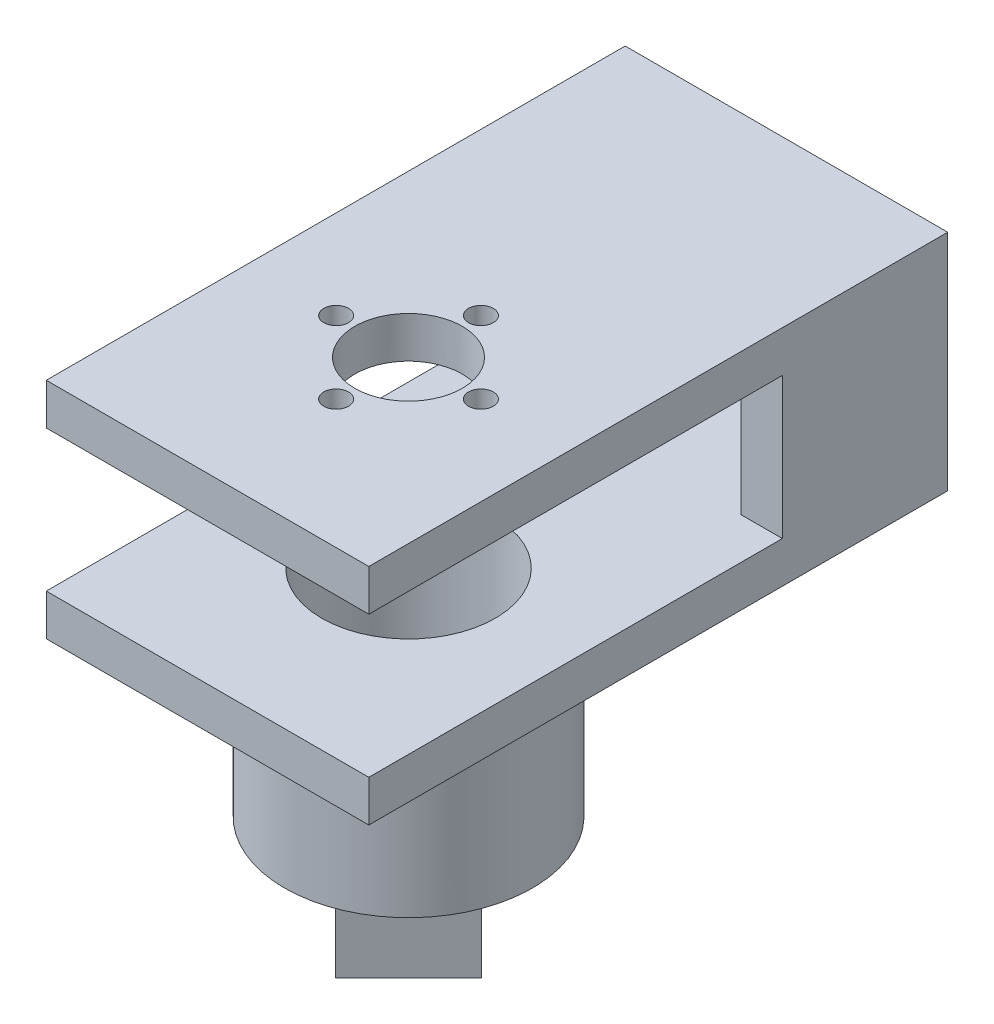
ISO-10303-21;
HEADER;
FILE_DESCRIPTION(('STEP AP214'),'2;1');
FILE_NAME('part.step','',(''),(''),'','','');
FILE_SCHEMA(('AUTOMOTIVE_DESIGN { 1 0 10303 214 1 1 1 1 }'));
ENDSEC;
DATA;
#1=APPLICATION_CONTEXT('core data for automotive mechanical design processes');
#2=APPLICATION_PROTOCOL_DEFINITION('international standard','automotive_design',2000,#1);
#3=PRODUCT_CONTEXT('',#1,'mechanical');
#4=PRODUCT('Part','Part','',(#3));
#5=PRODUCT_RELATED_PRODUCT_CATEGORY('part','',(#4));
#6=PRODUCT_DEFINITION_FORMATION('','',#4);
#7=PRODUCT_DEFINITION_CONTEXT('part definition',#1,'design');
#8=PRODUCT_DEFINITION('design','',#6,#7);
#9=PRODUCT_DEFINITION_SHAPE('','',#8);
#10=(LENGTH_UNIT() NAMED_UNIT(*) SI_UNIT(.MILLI.,.METRE.));
#11=(NAMED_UNIT(*) PLANE_ANGLE_UNIT() SI_UNIT($,.RADIAN.));
#12=(NAMED_UNIT(*) SI_UNIT($,.STERADIAN.) SOLID_ANGLE_UNIT());
#13=UNCERTAINTY_MEASURE_WITH_UNIT(LENGTH_MEASURE(1.E-05),#10,'distance_accuracy_value','');
#14=(GEOMETRIC_REPRESENTATION_CONTEXT(3) GLOBAL_UNCERTAINTY_ASSIGNED_CONTEXT((#13)) GLOBAL_UNIT_ASSIGNED_CONTEXT((#10,
#11,#12)) REPRESENTATION_CONTEXT('',''));
#15=CARTESIAN_POINT('',(0.,0.,0.));
#16=DIRECTION('',(0.,0.,1.));
#17=DIRECTION('',(1.,0.,0.));
#18=AXIS2_PLACEMENT_3D('',#15,#16,#17);
#19=CARTESIAN_POINT('',(29.,-86.1555555555556,91.3984830430161));
#20=DIRECTION('',(0.,-1.,0.));
#21=DIRECTION('',(0.,0.,-1.));
#22=AXIS2_PLACEMENT_3D('',#19,#20,#21);
#23=PLANE('',#22);
#24=CARTESIAN_POINT('',(29.,-86.1555555555556,91.3984830430161));
#25=DIRECTION('',(0.,-1.,0.));
#26=DIRECTION('',(0.,0.,-1.));
#27=AXIS2_PLACEMENT_3D('',#24,#25,#26);
#28=CIRCLE('',#27,30.);
#29=CARTESIAN_POINT('',(29.,-86.1555555555556,61.3984830430161));
#30=VERTEX_POINT('',#29);
#31=EDGE_CURVE('E245',#30,#30,#28,.T.);
#32=ORIENTED_EDGE('',*,*,#31,.T.);
#33=EDGE_LOOP('',(#32));
#34=FACE_BOUND('',#33,.T.);
#35=DIRECTION('',(-0.707106781186546,0.,-0.707106781186549));
#36=VECTOR('',#35,1.);
#37=CARTESIAN_POINT('',(11.3223304703363,-86.1555555555556,91.398483043016));
#38=LINE('',#37,#36);
#39=CARTESIAN_POINT('',(29.,-86.1555555555556,109.07615257268));
#40=VERTEX_POINT('',#39);
#41=CARTESIAN_POINT('',(11.3223304703363,-86.1555555555556,91.398483043016));
#42=VERTEX_POINT('',#41);
#43=EDGE_CURVE('E914',#40,#42,#38,.T.);
#44=ORIENTED_EDGE('',*,*,#43,.F.);
#45=DIRECTION('',(-0.707106781186549,0.,0.707106781186546));
#46=VECTOR('',#45,1.);
#47=CARTESIAN_POINT('',(29.,-86.1555555555556,109.07615257268));
#48=LINE('',#47,#46);
#49=CARTESIAN_POINT('',(46.6776695296637,-86.1555555555556,91.3984830430161));
#50=VERTEX_POINT('',#49);
#51=EDGE_CURVE('E233',#50,#40,#48,.T.);
#52=ORIENTED_EDGE('',*,*,#51,.F.);
#53=DIRECTION('',(0.707106781186546,0.,0.707106781186549));
#54=VECTOR('',#53,1.);
#55=CARTESIAN_POINT('',(29.,-86.1555555555556,73.7208135133524));
#56=LINE('',#55,#54);
#57=CARTESIAN_POINT('',(29.,-86.1555555555556,73.7208135133524));
#58=VERTEX_POINT('',#57);
#59=EDGE_CURVE('E229',#58,#50,#56,.T.);
#60=ORIENTED_EDGE('',*,*,#59,.F.);
#61=DIRECTION('',(0.707106781186549,0.,-0.707106781186546));
#62=VECTOR('',#61,1.);
#63=CARTESIAN_POINT('',(11.3223304703363,-86.1555555555556,91.398483043016));
#64=LINE('',#63,#62);
#65=EDGE_CURVE('E911',#42,#58,#64,.T.);
#66=ORIENTED_EDGE('',*,*,#65,.F.);
#67=EDGE_LOOP('',(#44,#52,#60,#66));
#68=FACE_BOUND('',#67,.T.);
#69=ADVANCED_FACE('F73',(#34,#68),#23,.T.);
#70=CARTESIAN_POINT('',(0.,-44.1555555555556,40.));
#71=DIRECTION('',(0.,1.,0.));
#72=DIRECTION('',(0.,0.,1.));
#73=AXIS2_PLACEMENT_3D('',#70,#71,#72);
#74=PLANE('',#73);
#75=DIRECTION('',(1.,0.,0.));
#76=VECTOR('',#75,1.);
#77=CARTESIAN_POINT('',(0.,-44.1555555555556,0.));
#78=LINE('',#77,#76);
#79=CARTESIAN_POINT('',(-10.,-44.1555555555556,0.));
#80=VERTEX_POINT('',#79);
#81=CARTESIAN_POINT('',(68.,-44.1555555555556,0.));
#82=VERTEX_POINT('',#81);
#83=EDGE_CURVE('E383',#80,#82,#78,.T.);
#84=ORIENTED_EDGE('',*,*,#83,.T.);
#85=DIRECTION('',(0.,0.,-1.));
#86=VECTOR('',#85,1.);
#87=CARTESIAN_POINT('',(68.,-44.1555555555556,40.));
#88=LINE('',#87,#86);
#89=CARTESIAN_POINT('',(68.,-44.1555555555556,140.));
#90=VERTEX_POINT('',#89);
#91=EDGE_CURVE('E393',#90,#82,#88,.T.);
#92=ORIENTED_EDGE('',*,*,#91,.F.);
#93=DIRECTION('',(1.,0.,0.));
#94=VECTOR('',#93,1.);
#95=CARTESIAN_POINT('',(-10.,-44.1555555555556,140.));
#96=LINE('',#95,#94);
#97=CARTESIAN_POINT('',(-10.,-44.1555555555556,140.));
#98=VERTEX_POINT('',#97);
#99=EDGE_CURVE('E328',#98,#90,#96,.T.);
#100=ORIENTED_EDGE('',*,*,#99,.F.);
#101=DIRECTION('',(0.,0.,-1.));
#102=VECTOR('',#101,1.);
#103=CARTESIAN_POINT('',(-10.,-44.1555555555556,40.));
#104=LINE('',#103,#102);
#105=EDGE_CURVE('E396',#98,#80,#104,.T.);
#106=ORIENTED_EDGE('',*,*,#105,.T.);
#107=EDGE_LOOP('',(#84,#92,#100,#106));
#108=FACE_BOUND('',#107,.T.);
#109=CARTESIAN_POINT('',(29.,-44.1555555555556,91.3984830430161));
#110=DIRECTION('',(0.,1.,0.));
#111=DIRECTION('',(0.,0.,1.));
#112=AXIS2_PLACEMENT_3D('',#109,#110,#111);
#113=CIRCLE('',#112,30.);
#114=CARTESIAN_POINT('',(29.,-44.1555555555556,121.398483043016));
#115=VERTEX_POINT('',#114);
#116=EDGE_CURVE('E13',#115,#115,#113,.F.);
#117=ORIENTED_EDGE('',*,*,#116,.F.);
#118=EDGE_LOOP('',(#117));
#119=FACE_BOUND('',#118,.T.);
#120=ADVANCED_FACE('F485',(#108,#119),#74,.F.);
#121=CARTESIAN_POINT('',(0.,0.,40.));
#122=DIRECTION('',(0.,0.,1.));
#123=DIRECTION('',(1.,0.,0.));
#124=AXIS2_PLACEMENT_3D('',#121,#122,#123);
#125=PLANE('',#124);
#126=DIRECTION('',(0.,1.,0.));
#127=VECTOR('',#126,1.);
#128=CARTESIAN_POINT('',(68.,0.,40.));
#129=LINE('',#128,#127);
#130=CARTESIAN_POINT('',(68.,-34.1555555555556,40.));
#131=VERTEX_POINT('',#130);
#132=CARTESIAN_POINT('',(68.,0.,40.));
#133=VERTEX_POINT('',#132);
#134=EDGE_CURVE('E376',#131,#133,#129,.T.);
#135=ORIENTED_EDGE('',*,*,#134,.T.);
#136=DIRECTION('',(1.,0.,0.));
#137=VECTOR('',#136,1.);
#138=CARTESIAN_POINT('',(0.,0.,40.));
#139=LINE('',#138,#137);
#140=CARTESIAN_POINT('',(58.,0.,40.));
#141=VERTEX_POINT('',#140);
#142=EDGE_CURVE('E276',#141,#133,#139,.T.);
#143=ORIENTED_EDGE('',*,*,#142,.F.);
#144=DIRECTION('',(0.,1.,0.));
#145=VECTOR('',#144,1.);
#146=CARTESIAN_POINT('',(58.,0.,40.));
#147=LINE('',#146,#145);
#148=CARTESIAN_POINT('',(58.,-34.1555555555556,40.));
#149=VERTEX_POINT('',#148);
#150=EDGE_CURVE('E350',#149,#141,#147,.T.);
#151=ORIENTED_EDGE('',*,*,#150,.F.);
#152=DIRECTION('',(-1.,0.,0.));
#153=VECTOR('',#152,1.);
#154=CARTESIAN_POINT('',(-10.,-34.1555555555556,40.));
#155=LINE('',#154,#153);
#156=EDGE_CURVE('E325',#131,#149,#155,.T.);
#157=ORIENTED_EDGE('',*,*,#156,.F.);
#158=EDGE_LOOP('',(#135,#143,#151,#157));
#159=FACE_BOUND('',#158,.T.);
#160=ADVANCED_FACE('F436',(#159),#125,.T.);
#161=DIRECTION('',(0.,-1.,0.));
#162=VECTOR('',#161,1.);
#163=CARTESIAN_POINT('',(0.,0.,40.));
#164=LINE('',#163,#162);
#165=CARTESIAN_POINT('',(0.,0.,40.));
#166=VERTEX_POINT('',#165);
#167=CARTESIAN_POINT('',(0.,-34.1555555555556,40.));
#168=VERTEX_POINT('',#167);
#169=EDGE_CURVE('E347',#166,#168,#164,.T.);
#170=ORIENTED_EDGE('',*,*,#169,.F.);
#171=CARTESIAN_POINT('',(-10.,0.,40.));
#172=VERTEX_POINT('',#171);
#173=EDGE_CURVE('E273',#172,#166,#139,.T.);
#174=ORIENTED_EDGE('',*,*,#173,.F.);
#175=DIRECTION('',(0.,-1.,0.));
#176=VECTOR('',#175,1.);
#177=CARTESIAN_POINT('',(-10.,0.,40.));
#178=LINE('',#177,#176);
#179=CARTESIAN_POINT('',(-10.,-34.1555555555556,40.));
#180=VERTEX_POINT('',#179);
#181=EDGE_CURVE('E374',#172,#180,#178,.T.);
#182=ORIENTED_EDGE('',*,*,#181,.T.);
#183=EDGE_CURVE('E81',#168,#180,#155,.T.);
#184=ORIENTED_EDGE('',*,*,#183,.F.);
#185=EDGE_LOOP('',(#170,#174,#182,#184));
#186=FACE_BOUND('',#185,.T.);
#187=ADVANCED_FACE('F459',(#186),#125,.T.);
#188=CARTESIAN_POINT('',(0.,0.,0.));
#189=DIRECTION('',(0.,0.,1.));
#190=DIRECTION('',(1.,0.,0.));
#191=AXIS2_PLACEMENT_3D('',#188,#189,#190);
#192=PLANE('',#191);
#193=DIRECTION('',(0.,-1.,0.));
#194=VECTOR('',#193,1.);
#195=CARTESIAN_POINT('',(0.,0.,0.));
#196=LINE('',#195,#194);
#197=CARTESIAN_POINT('',(0.,0.,0.));
#198=VERTEX_POINT('',#197);
#199=CARTESIAN_POINT('',(0.,-29.1555555555555,0.));
#200=VERTEX_POINT('',#199);
#201=EDGE_CURVE('E346',#198,#200,#196,.T.);
#202=ORIENTED_EDGE('',*,*,#201,.T.);
#203=DIRECTION('',(0.707106781186547,-0.707106781186548,0.));
#204=VECTOR('',#203,1.);
#205=CARTESIAN_POINT('',(5.,-34.1555555555556,0.));
#206=LINE('',#205,#204);
#207=CARTESIAN_POINT('',(5.,-34.1555555555556,0.));
#208=VERTEX_POINT('',#207);
#209=EDGE_CURVE('E96',#200,#208,#206,.T.);
#210=ORIENTED_EDGE('',*,*,#209,.T.);
#211=DIRECTION('',(1.,0.,0.));
#212=VECTOR('',#211,1.);
#213=CARTESIAN_POINT('',(0.,-34.1555555555556,0.));
#214=LINE('',#213,#212);
#215=CARTESIAN_POINT('',(53.,-34.1555555555556,0.));
#216=VERTEX_POINT('',#215);
#217=EDGE_CURVE('E356',#208,#216,#214,.T.);
#218=ORIENTED_EDGE('',*,*,#217,.T.);
#219=DIRECTION('',(0.707106781186547,0.707106781186548,0.));
#220=VECTOR('',#219,1.);
#221=CARTESIAN_POINT('',(53.,-34.1555555555556,0.));
#222=LINE('',#221,#220);
#223=CARTESIAN_POINT('',(58.,-29.1555555555555,0.));
#224=VERTEX_POINT('',#223);
#225=EDGE_CURVE('E302',#216,#224,#222,.T.);
#226=ORIENTED_EDGE('',*,*,#225,.T.);
#227=DIRECTION('',(0.,1.,0.));
#228=VECTOR('',#227,1.);
#229=CARTESIAN_POINT('',(58.,0.,0.));
#230=LINE('',#229,#228);
#231=CARTESIAN_POINT('',(58.,0.,0.));
#232=VERTEX_POINT('',#231);
#233=EDGE_CURVE('E358',#224,#232,#230,.T.);
#234=ORIENTED_EDGE('',*,*,#233,.T.);
#235=DIRECTION('',(-1.,0.,0.));
#236=VECTOR('',#235,1.);
#237=CARTESIAN_POINT('',(0.,0.,0.));
#238=LINE('',#237,#236);
#239=EDGE_CURVE('E351',#232,#198,#238,.T.);
#240=ORIENTED_EDGE('',*,*,#239,.T.);
#241=EDGE_LOOP('',(#202,#210,#218,#226,#234,#240));
#242=FACE_BOUND('',#241,.T.);
#243=DIRECTION('',(0.,-1.,0.));
#244=VECTOR('',#243,1.);
#245=CARTESIAN_POINT('',(-10.,0.,0.));
#246=LINE('',#245,#244);
#247=CARTESIAN_POINT('',(-10.,10.,0.));
#248=VERTEX_POINT('',#247);
#249=EDGE_CURVE('E373',#248,#80,#246,.T.);
#250=ORIENTED_EDGE('',*,*,#249,.F.);
#251=DIRECTION('',(-1.,0.,0.));
#252=VECTOR('',#251,1.);
#253=CARTESIAN_POINT('',(0.,10.,0.));
#254=LINE('',#253,#252);
#255=CARTESIAN_POINT('',(68.,10.,0.));
#256=VERTEX_POINT('',#255);
#257=EDGE_CURVE('E377',#256,#248,#254,.T.);
#258=ORIENTED_EDGE('',*,*,#257,.F.);
#259=DIRECTION('',(0.,1.,0.));
#260=VECTOR('',#259,1.);
#261=CARTESIAN_POINT('',(68.,0.,0.));
#262=LINE('',#261,#260);
#263=EDGE_CURVE('E385',#82,#256,#262,.T.);
#264=ORIENTED_EDGE('',*,*,#263,.F.);
#265=ORIENTED_EDGE('',*,*,#83,.F.);
#266=EDGE_LOOP('',(#250,#258,#264,#265));
#267=FACE_BOUND('',#266,.T.);
#268=ADVANCED_FACE('F428',(#242,#267),#192,.F.);
#269=CARTESIAN_POINT('',(-10.,0.,40.));
#270=DIRECTION('',(1.,0.,0.));
#271=DIRECTION('',(0.,0.,-1.));
#272=AXIS2_PLACEMENT_3D('',#269,#270,#271);
#273=PLANE('',#272);
#274=ORIENTED_EDGE('',*,*,#249,.T.);
#275=ORIENTED_EDGE('',*,*,#105,.F.);
#276=DIRECTION('',(0.,-1.,0.));
#277=VECTOR('',#276,1.);
#278=CARTESIAN_POINT('',(-10.,-34.1555555555556,140.));
#279=LINE('',#278,#277);
#280=CARTESIAN_POINT('',(-10.,-34.1555555555556,140.));
#281=VERTEX_POINT('',#280);
#282=EDGE_CURVE('E335',#281,#98,#279,.T.);
#283=ORIENTED_EDGE('',*,*,#282,.F.);
#284=DIRECTION('',(0.,0.,-1.));
#285=VECTOR('',#284,1.);
#286=CARTESIAN_POINT('',(-10.,-34.1555555555556,140.));
#287=LINE('',#286,#285);
#288=EDGE_CURVE('E338',#281,#180,#287,.T.);
#289=ORIENTED_EDGE('',*,*,#288,.T.);
#290=ORIENTED_EDGE('',*,*,#181,.F.);
#291=DIRECTION('',(0.,0.,-1.));
#292=VECTOR('',#291,1.);
#293=CARTESIAN_POINT('',(-10.,0.,218.63841300535));
#294=LINE('',#293,#292);
#295=CARTESIAN_POINT('',(-10.,0.,140.));
#296=VERTEX_POINT('',#295);
#297=EDGE_CURVE('E272',#296,#172,#294,.T.);
#298=ORIENTED_EDGE('',*,*,#297,.F.);
#299=DIRECTION('',(0.,-1.,0.));
#300=VECTOR('',#299,1.);
#301=CARTESIAN_POINT('',(-10.,0.,140.));
#302=LINE('',#301,#300);
#303=CARTESIAN_POINT('',(-10.,10.,140.));
#304=VERTEX_POINT('',#303);
#305=EDGE_CURVE('E284',#304,#296,#302,.T.);
#306=ORIENTED_EDGE('',*,*,#305,.F.);
#307=DIRECTION('',(0.,0.,-1.));
#308=VECTOR('',#307,1.);
#309=CARTESIAN_POINT('',(-10.,10.,40.));
#310=LINE('',#309,#308);
#311=EDGE_CURVE('E380',#304,#248,#310,.T.);
#312=ORIENTED_EDGE('',*,*,#311,.T.);
#313=EDGE_LOOP('',(#274,#275,#283,#289,#290,#298,#306,#312));
#314=FACE_BOUND('',#313,.T.);
#315=ADVANCED_FACE('F75',(#314),#273,.F.);
#316=CARTESIAN_POINT('',(68.,0.,40.));
#317=DIRECTION('',(-1.,0.,0.));
#318=DIRECTION('',(0.,0.,1.));
#319=AXIS2_PLACEMENT_3D('',#316,#317,#318);
#320=PLANE('',#319);
#321=ORIENTED_EDGE('',*,*,#263,.T.);
#322=DIRECTION('',(0.,0.,-1.));
#323=VECTOR('',#322,1.);
#324=CARTESIAN_POINT('',(68.,10.,40.));
#325=LINE('',#324,#323);
#326=CARTESIAN_POINT('',(68.,10.,140.));
#327=VERTEX_POINT('',#326);
#328=EDGE_CURVE('E390',#327,#256,#325,.T.);
#329=ORIENTED_EDGE('',*,*,#328,.F.);
#330=DIRECTION('',(0.,1.,0.));
#331=VECTOR('',#330,1.);
#332=CARTESIAN_POINT('',(68.,0.,140.));
#333=LINE('',#332,#331);
#334=CARTESIAN_POINT('',(68.,0.,140.));
#335=VERTEX_POINT('',#334);
#336=EDGE_CURVE('E277',#335,#327,#333,.T.);
#337=ORIENTED_EDGE('',*,*,#336,.F.);
#338=DIRECTION('',(0.,0.,-1.));
#339=VECTOR('',#338,1.);
#340=CARTESIAN_POINT('',(68.,0.,218.63841300535));
#341=LINE('',#340,#339);
#342=EDGE_CURVE('E275',#335,#133,#341,.T.);
#343=ORIENTED_EDGE('',*,*,#342,.T.);
#344=ORIENTED_EDGE('',*,*,#134,.F.);
#345=DIRECTION('',(0.,0.,-1.));
#346=VECTOR('',#345,1.);
#347=CARTESIAN_POINT('',(68.,-34.1555555555556,140.));
#348=LINE('',#347,#346);
#349=CARTESIAN_POINT('',(68.,-34.1555555555556,140.));
#350=VERTEX_POINT('',#349);
#351=EDGE_CURVE('E343',#350,#131,#348,.T.);
#352=ORIENTED_EDGE('',*,*,#351,.F.);
#353=DIRECTION('',(0.,1.,0.));
#354=VECTOR('',#353,1.);
#355=CARTESIAN_POINT('',(68.,-44.1555555555556,140.));
#356=LINE('',#355,#354);
#357=EDGE_CURVE('E331',#90,#350,#356,.T.);
#358=ORIENTED_EDGE('',*,*,#357,.F.);
#359=ORIENTED_EDGE('',*,*,#91,.T.);
#360=EDGE_LOOP('',(#321,#329,#337,#343,#344,#352,#358,#359));
#361=FACE_BOUND('',#360,.T.);
#362=ADVANCED_FACE('F446',(#361),#320,.F.);
#363=CARTESIAN_POINT('',(0.,10.,40.));
#364=DIRECTION('',(0.,-1.,0.));
#365=DIRECTION('',(0.,0.,-1.));
#366=AXIS2_PLACEMENT_3D('',#363,#364,#365);
#367=PLANE('',#366);
#368=CARTESIAN_POINT('',(11.5,10.,91.3984830430161));
#369=DIRECTION('',(0.,1.,0.));
#370=DIRECTION('',(1.,0.,0.));
#371=AXIS2_PLACEMENT_3D('',#368,#369,#370);
#372=CIRCLE('',#371,3.);
#373=CARTESIAN_POINT('',(14.5,10.,91.3984830430161));
#374=VERTEX_POINT('',#373);
#375=EDGE_CURVE('E252',#374,#374,#372,.T.);
#376=ORIENTED_EDGE('',*,*,#375,.F.);
#377=EDGE_LOOP('',(#376));
#378=FACE_BOUND('',#377,.T.);
#379=CARTESIAN_POINT('',(29.,10.,108.898483043016));
#380=DIRECTION('',(0.,1.,0.));
#381=DIRECTION('',(0.,0.,-1.));
#382=AXIS2_PLACEMENT_3D('',#379,#380,#381);
#383=CIRCLE('',#382,3.);
#384=CARTESIAN_POINT('',(29.,10.,105.898483043016));
#385=VERTEX_POINT('',#384);
#386=EDGE_CURVE('E256',#385,#385,#383,.T.);
#387=ORIENTED_EDGE('',*,*,#386,.F.);
#388=EDGE_LOOP('',(#387));
#389=FACE_BOUND('',#388,.T.);
#390=CARTESIAN_POINT('',(46.5,10.,91.3984830430159));
#391=DIRECTION('',(0.,1.,0.));
#392=DIRECTION('',(-1.,0.,0.));
#393=AXIS2_PLACEMENT_3D('',#390,#391,#392);
#394=CIRCLE('',#393,3.);
#395=CARTESIAN_POINT('',(43.5,10.,91.3984830430159));
#396=VERTEX_POINT('',#395);
#397=EDGE_CURVE('E251',#396,#396,#394,.T.);
#398=ORIENTED_EDGE('',*,*,#397,.F.);
#399=EDGE_LOOP('',(#398));
#400=FACE_BOUND('',#399,.T.);
#401=CARTESIAN_POINT('',(29.,10.,73.8984830430161));
#402=DIRECTION('',(0.,1.,0.));
#403=DIRECTION('',(0.,0.,1.));
#404=AXIS2_PLACEMENT_3D('',#401,#402,#403);
#405=CIRCLE('',#404,3.);
#406=CARTESIAN_POINT('',(29.,10.,76.8984830430161));
#407=VERTEX_POINT('',#406);
#408=EDGE_CURVE('E261',#407,#407,#405,.T.);
#409=ORIENTED_EDGE('',*,*,#408,.F.);
#410=EDGE_LOOP('',(#409));
#411=FACE_BOUND('',#410,.T.);
#412=CARTESIAN_POINT('',(29.,10.,91.3984830430161));
#413=DIRECTION('',(0.,1.,0.));
#414=DIRECTION('',(0.,0.,1.));
#415=AXIS2_PLACEMENT_3D('',#412,#413,#414);
#416=CIRCLE('',#415,13.);
#417=CARTESIAN_POINT('',(29.,10.,104.398483043016));
#418=VERTEX_POINT('',#417);
#419=EDGE_CURVE('E265',#418,#418,#416,.T.);
#420=ORIENTED_EDGE('',*,*,#419,.F.);
#421=EDGE_LOOP('',(#420));
#422=FACE_BOUND('',#421,.T.);
#423=ORIENTED_EDGE('',*,*,#257,.T.);
#424=ORIENTED_EDGE('',*,*,#311,.F.);
#425=DIRECTION('',(-1.,0.,0.));
#426=VECTOR('',#425,1.);
#427=CARTESIAN_POINT('',(0.,10.,140.));
#428=LINE('',#427,#426);
#429=EDGE_CURVE('E287',#327,#304,#428,.T.);
#430=ORIENTED_EDGE('',*,*,#429,.F.);
#431=ORIENTED_EDGE('',*,*,#328,.T.);
#432=EDGE_LOOP('',(#423,#424,#430,#431));
#433=FACE_BOUND('',#432,.T.);
#434=ADVANCED_FACE('F787',(#378,#389,#400,#411,#422,#433),#367,.F.);
#435=CARTESIAN_POINT('',(0.,0.,40.));
#436=DIRECTION('',(1.,0.,0.));
#437=DIRECTION('',(0.,0.,-1.));
#438=AXIS2_PLACEMENT_3D('',#435,#436,#437);
#439=PLANE('',#438);
#440=DIRECTION('',(0.,0.,-1.));
#441=VECTOR('',#440,1.);
#442=CARTESIAN_POINT('',(0.,-29.1555555555555,5.));
#443=LINE('',#442,#441);
#444=CARTESIAN_POINT('',(0.,-29.1555555555555,5.));
#445=VERTEX_POINT('',#444);
#446=EDGE_CURVE('E295',#445,#200,#443,.T.);
#447=ORIENTED_EDGE('',*,*,#446,.T.);
#448=ORIENTED_EDGE('',*,*,#201,.F.);
#449=DIRECTION('',(0.,0.,-1.));
#450=VECTOR('',#449,1.);
#451=CARTESIAN_POINT('',(0.,0.,40.));
#452=LINE('',#451,#450);
#453=EDGE_CURVE('E354',#166,#198,#452,.T.);
#454=ORIENTED_EDGE('',*,*,#453,.F.);
#455=ORIENTED_EDGE('',*,*,#169,.T.);
#456=DIRECTION('',(0.,0.,-1.));
#457=VECTOR('',#456,1.);
#458=CARTESIAN_POINT('',(0.,-34.1555555555556,40.));
#459=LINE('',#458,#457);
#460=CARTESIAN_POINT('',(0.,-34.1555555555556,5.));
#461=VERTEX_POINT('',#460);
#462=EDGE_CURVE('E370',#168,#461,#459,.T.);
#463=ORIENTED_EDGE('',*,*,#462,.T.);
#464=DIRECTION('',(0.,1.,0.));
#465=VECTOR('',#464,1.);
#466=CARTESIAN_POINT('',(0.,-29.1555555555555,5.));
#467=LINE('',#466,#465);
#468=EDGE_CURVE('E298',#461,#445,#467,.T.);
#469=ORIENTED_EDGE('',*,*,#468,.T.);
#470=EDGE_LOOP('',(#447,#448,#454,#455,#463,#469));
#471=FACE_BOUND('',#470,.T.);
#472=ADVANCED_FACE('F463',(#471),#439,.T.);
#473=CARTESIAN_POINT('',(0.,-34.1555555555556,40.));
#474=DIRECTION('',(0.,1.,0.));
#475=DIRECTION('',(0.,0.,1.));
#476=AXIS2_PLACEMENT_3D('',#473,#474,#475);
#477=PLANE('',#476);
#478=CARTESIAN_POINT('',(29.,-34.1555555555556,91.3984830430161));
#479=DIRECTION('',(0.,1.,0.));
#480=DIRECTION('',(0.,0.,1.));
#481=AXIS2_PLACEMENT_3D('',#478,#479,#480);
#482=CIRCLE('',#481,21.);
#483=CARTESIAN_POINT('',(29.,-34.1555555555556,112.398483043016));
#484=VERTEX_POINT('',#483);
#485=EDGE_CURVE('E280',#484,#484,#482,.T.);
#486=ORIENTED_EDGE('',*,*,#485,.F.);
#487=EDGE_LOOP('',(#486));
#488=FACE_BOUND('',#487,.T.);
#489=DIRECTION('',(0.,0.,-1.));
#490=VECTOR('',#489,1.);
#491=CARTESIAN_POINT('',(5.,-34.1555555555556,5.));
#492=LINE('',#491,#490);
#493=CARTESIAN_POINT('',(5.,-34.1555555555556,5.));
#494=VERTEX_POINT('',#493);
#495=EDGE_CURVE('E296',#494,#208,#492,.T.);
#496=ORIENTED_EDGE('',*,*,#495,.F.);
#497=DIRECTION('',(-1.,0.,0.));
#498=VECTOR('',#497,1.);
#499=CARTESIAN_POINT('',(0.,-34.1555555555556,5.));
#500=LINE('',#499,#498);
#501=EDGE_CURVE('E306',#494,#461,#500,.T.);
#502=ORIENTED_EDGE('',*,*,#501,.T.);
#503=ORIENTED_EDGE('',*,*,#462,.F.);
#504=ORIENTED_EDGE('',*,*,#183,.T.);
#505=ORIENTED_EDGE('',*,*,#288,.F.);
#506=DIRECTION('',(-1.,0.,0.));
#507=VECTOR('',#506,1.);
#508=CARTESIAN_POINT('',(-10.,-34.1555555555556,140.));
#509=LINE('',#508,#507);
#510=EDGE_CURVE('E333',#350,#281,#509,.T.);
#511=ORIENTED_EDGE('',*,*,#510,.F.);
#512=ORIENTED_EDGE('',*,*,#351,.T.);
#513=ORIENTED_EDGE('',*,*,#156,.T.);
#514=DIRECTION('',(0.,0.,-1.));
#515=VECTOR('',#514,1.);
#516=CARTESIAN_POINT('',(58.,-34.1555555555556,40.));
#517=LINE('',#516,#515);
#518=CARTESIAN_POINT('',(58.,-34.1555555555556,5.));
#519=VERTEX_POINT('',#518);
#520=EDGE_CURVE('E367',#149,#519,#517,.T.);
#521=ORIENTED_EDGE('',*,*,#520,.T.);
#522=DIRECTION('',(-1.,0.,0.));
#523=VECTOR('',#522,1.);
#524=CARTESIAN_POINT('',(58.,-34.1555555555556,5.));
#525=LINE('',#524,#523);
#526=CARTESIAN_POINT('',(53.,-34.1555555555556,5.));
#527=VERTEX_POINT('',#526);
#528=EDGE_CURVE('E317',#519,#527,#525,.T.);
#529=ORIENTED_EDGE('',*,*,#528,.T.);
#530=DIRECTION('',(0.,0.,-1.));
#531=VECTOR('',#530,1.);
#532=CARTESIAN_POINT('',(53.,-34.1555555555556,5.));
#533=LINE('',#532,#531);
#534=EDGE_CURVE('E322',#527,#216,#533,.T.);
#535=ORIENTED_EDGE('',*,*,#534,.T.);
#536=ORIENTED_EDGE('',*,*,#217,.F.);
#537=EDGE_LOOP('',(#496,#502,#503,#504,#505,#511,#512,#513,#521,#529,#535,#536));
#538=FACE_BOUND('',#537,.T.);
#539=ADVANCED_FACE('F440',(#488,#538),#477,.T.);
#540=CARTESIAN_POINT('',(58.,0.,40.));
#541=DIRECTION('',(-1.,0.,0.));
#542=DIRECTION('',(0.,0.,1.));
#543=AXIS2_PLACEMENT_3D('',#540,#541,#542);
#544=PLANE('',#543);
#545=DIRECTION('',(0.,0.,-1.));
#546=VECTOR('',#545,1.);
#547=CARTESIAN_POINT('',(58.,-29.1555555555555,5.));
#548=LINE('',#547,#546);
#549=CARTESIAN_POINT('',(58.,-29.1555555555555,5.));
#550=VERTEX_POINT('',#549);
#551=EDGE_CURVE('E320',#550,#224,#548,.T.);
#552=ORIENTED_EDGE('',*,*,#551,.F.);
#553=DIRECTION('',(0.,-1.,0.));
#554=VECTOR('',#553,1.);
#555=CARTESIAN_POINT('',(58.,-29.1555555555555,5.));
#556=LINE('',#555,#554);
#557=EDGE_CURVE('E314',#550,#519,#556,.T.);
#558=ORIENTED_EDGE('',*,*,#557,.T.);
#559=ORIENTED_EDGE('',*,*,#520,.F.);
#560=ORIENTED_EDGE('',*,*,#150,.T.);
#561=DIRECTION('',(0.,0.,-1.));
#562=VECTOR('',#561,1.);
#563=CARTESIAN_POINT('',(58.,0.,40.));
#564=LINE('',#563,#562);
#565=EDGE_CURVE('E364',#141,#232,#564,.T.);
#566=ORIENTED_EDGE('',*,*,#565,.T.);
#567=ORIENTED_EDGE('',*,*,#233,.F.);
#568=EDGE_LOOP('',(#552,#558,#559,#560,#566,#567));
#569=FACE_BOUND('',#568,.T.);
#570=ADVANCED_FACE('F415',(#569),#544,.T.);
#571=CARTESIAN_POINT('',(0.,0.,40.));
#572=DIRECTION('',(0.,-1.,0.));
#573=DIRECTION('',(0.,0.,-1.));
#574=AXIS2_PLACEMENT_3D('',#571,#572,#573);
#575=PLANE('',#574);
#576=CARTESIAN_POINT('',(11.5,0.,91.3984830430161));
#577=DIRECTION('',(0.,-1.,0.));
#578=DIRECTION('',(0.,0.,-1.));
#579=AXIS2_PLACEMENT_3D('',#576,#577,#578);
#580=CIRCLE('',#579,3.);
#581=CARTESIAN_POINT('',(11.5,0.,88.3984830430161));
#582=VERTEX_POINT('',#581);
#583=EDGE_CURVE('E264',#582,#582,#580,.T.);
#584=ORIENTED_EDGE('',*,*,#583,.F.);
#585=EDGE_LOOP('',(#584));
#586=FACE_BOUND('',#585,.T.);
#587=CARTESIAN_POINT('',(29.,0.,108.898483043016));
#588=DIRECTION('',(0.,-1.,0.));
#589=DIRECTION('',(0.,0.,-1.));
#590=AXIS2_PLACEMENT_3D('',#587,#588,#589);
#591=CIRCLE('',#590,3.);
#592=CARTESIAN_POINT('',(29.,0.,105.898483043016));
#593=VERTEX_POINT('',#592);
#594=EDGE_CURVE('E403',#593,#593,#591,.T.);
#595=ORIENTED_EDGE('',*,*,#594,.F.);
#596=EDGE_LOOP('',(#595));
#597=FACE_BOUND('',#596,.T.);
#598=CARTESIAN_POINT('',(46.5,0.,91.3984830430159));
#599=DIRECTION('',(0.,-1.,0.));
#600=DIRECTION('',(0.,0.,-1.));
#601=AXIS2_PLACEMENT_3D('',#598,#599,#600);
#602=CIRCLE('',#601,3.);
#603=CARTESIAN_POINT('',(46.5,0.,88.3984830430159));
#604=VERTEX_POINT('',#603);
#605=EDGE_CURVE('E255',#604,#604,#602,.T.);
#606=ORIENTED_EDGE('',*,*,#605,.F.);
#607=EDGE_LOOP('',(#606));
#608=FACE_BOUND('',#607,.T.);
#609=CARTESIAN_POINT('',(29.,0.,73.8984830430161));
#610=DIRECTION('',(0.,-1.,0.));
#611=DIRECTION('',(0.,0.,-1.));
#612=AXIS2_PLACEMENT_3D('',#609,#610,#611);
#613=CIRCLE('',#612,3.);
#614=CARTESIAN_POINT('',(29.,0.,70.8984830430161));
#615=VERTEX_POINT('',#614);
#616=EDGE_CURVE('E263',#615,#615,#613,.T.);
#617=ORIENTED_EDGE('',*,*,#616,.F.);
#618=EDGE_LOOP('',(#617));
#619=FACE_BOUND('',#618,.T.);
#620=CARTESIAN_POINT('',(29.,0.,91.3984830430161));
#621=DIRECTION('',(0.,-1.,0.));
#622=DIRECTION('',(0.,0.,-1.));
#623=AXIS2_PLACEMENT_3D('',#620,#621,#622);
#624=CIRCLE('',#623,13.);
#625=CARTESIAN_POINT('',(29.,0.,78.3984830430161));
#626=VERTEX_POINT('',#625);
#627=EDGE_CURVE('E269',#626,#626,#624,.F.);
#628=ORIENTED_EDGE('',*,*,#627,.T.);
#629=EDGE_LOOP('',(#628));
#630=FACE_BOUND('',#629,.T.);
#631=ORIENTED_EDGE('',*,*,#239,.F.);
#632=ORIENTED_EDGE('',*,*,#565,.F.);
#633=ORIENTED_EDGE('',*,*,#142,.T.);
#634=ORIENTED_EDGE('',*,*,#342,.F.);
#635=DIRECTION('',(1.,0.,0.));
#636=VECTOR('',#635,1.);
#637=CARTESIAN_POINT('',(0.,0.,140.));
#638=LINE('',#637,#636);
#639=EDGE_CURVE('E281',#296,#335,#638,.T.);
#640=ORIENTED_EDGE('',*,*,#639,.F.);
#641=ORIENTED_EDGE('',*,*,#297,.T.);
#642=ORIENTED_EDGE('',*,*,#173,.T.);
#643=ORIENTED_EDGE('',*,*,#453,.T.);
#644=EDGE_LOOP('',(#631,#632,#633,#634,#640,#641,#642,#643));
#645=FACE_BOUND('',#644,.T.);
#646=ADVANCED_FACE('F411',(#586,#597,#608,#619,#630,#645),#575,.T.);
#647=CARTESIAN_POINT('',(0.,0.,140.));
#648=DIRECTION('',(0.,0.,1.));
#649=DIRECTION('',(1.,0.,0.));
#650=AXIS2_PLACEMENT_3D('',#647,#648,#649);
#651=PLANE('',#650);
#652=ORIENTED_EDGE('',*,*,#99,.T.);
#653=ORIENTED_EDGE('',*,*,#357,.T.);
#654=ORIENTED_EDGE('',*,*,#510,.T.);
#655=ORIENTED_EDGE('',*,*,#282,.T.);
#656=EDGE_LOOP('',(#652,#653,#654,#655));
#657=FACE_BOUND('',#656,.T.);
#658=ADVANCED_FACE('F414',(#657),#651,.T.);
#659=CARTESIAN_POINT('',(53.,-34.1555555555556,5.));
#660=DIRECTION('',(-0.707106781186548,0.707106781186547,0.));
#661=DIRECTION('',(-0.707106781186547,-0.707106781186548,0.));
#662=AXIS2_PLACEMENT_3D('',#659,#660,#661);
#663=PLANE('',#662);
#664=ORIENTED_EDGE('',*,*,#225,.F.);
#665=ORIENTED_EDGE('',*,*,#534,.F.);
#666=DIRECTION('',(0.707106781186547,0.707106781186548,0.));
#667=VECTOR('',#666,1.);
#668=CARTESIAN_POINT('',(53.,-34.1555555555556,5.));
#669=LINE('',#668,#667);
#670=EDGE_CURVE('E311',#527,#550,#669,.T.);
#671=ORIENTED_EDGE('',*,*,#670,.T.);
#672=ORIENTED_EDGE('',*,*,#551,.T.);
#673=EDGE_LOOP('',(#664,#665,#671,#672));
#674=FACE_BOUND('',#673,.T.);
#675=ADVANCED_FACE('F471',(#674),#663,.T.);
#676=CARTESIAN_POINT('',(0.,0.,5.));
#677=DIRECTION('',(0.,0.,-1.));
#678=DIRECTION('',(-1.,0.,0.));
#679=AXIS2_PLACEMENT_3D('',#676,#677,#678);
#680=PLANE('',#679);
#681=ORIENTED_EDGE('',*,*,#670,.F.);
#682=ORIENTED_EDGE('',*,*,#528,.F.);
#683=ORIENTED_EDGE('',*,*,#557,.F.);
#684=EDGE_LOOP('',(#681,#682,#683));
#685=FACE_BOUND('',#684,.T.);
#686=ADVANCED_FACE('F474',(#685),#680,.F.);
#687=CARTESIAN_POINT('',(5.,-34.1555555555556,5.));
#688=DIRECTION('',(0.707106781186548,0.707106781186547,0.));
#689=DIRECTION('',(-0.707106781186547,0.707106781186548,0.));
#690=AXIS2_PLACEMENT_3D('',#687,#688,#689);
#691=PLANE('',#690);
#692=ORIENTED_EDGE('',*,*,#209,.F.);
#693=ORIENTED_EDGE('',*,*,#446,.F.);
#694=DIRECTION('',(0.707106781186547,-0.707106781186548,0.));
#695=VECTOR('',#694,1.);
#696=CARTESIAN_POINT('',(5.,-34.1555555555556,5.));
#697=LINE('',#696,#695);
#698=EDGE_CURVE('E303',#445,#494,#697,.T.);
#699=ORIENTED_EDGE('',*,*,#698,.T.);
#700=ORIENTED_EDGE('',*,*,#495,.T.);
#701=EDGE_LOOP('',(#692,#693,#699,#700));
#702=FACE_BOUND('',#701,.T.);
#703=ADVANCED_FACE('F469',(#702),#691,.T.);
#704=CARTESIAN_POINT('',(0.,0.,5.));
#705=DIRECTION('',(0.,0.,1.));
#706=DIRECTION('',(1.,0.,0.));
#707=AXIS2_PLACEMENT_3D('',#704,#705,#706);
#708=PLANE('',#707);
#709=ORIENTED_EDGE('',*,*,#698,.F.);
#710=ORIENTED_EDGE('',*,*,#468,.F.);
#711=ORIENTED_EDGE('',*,*,#501,.F.);
#712=EDGE_LOOP('',(#709,#710,#711));
#713=FACE_BOUND('',#712,.T.);
#714=ADVANCED_FACE('F467',(#713),#708,.T.);
#715=CARTESIAN_POINT('',(29.,-44.1555555555556,91.3984830430161));
#716=DIRECTION('',(0.,1.,0.));
#717=DIRECTION('',(0.,0.,1.));
#718=AXIS2_PLACEMENT_3D('',#715,#716,#717);
#719=CYLINDRICAL_SURFACE('',#718,21.);
#720=ORIENTED_EDGE('',*,*,#485,.T.);
#721=EDGE_LOOP('',(#720));
#722=FACE_BOUND('',#721,.T.);
#723=CARTESIAN_POINT('',(29.,-66.1555555555556,91.3984830430161));
#724=DIRECTION('',(0.,-1.,0.));
#725=DIRECTION('',(0.,0.,-1.));
#726=AXIS2_PLACEMENT_3D('',#723,#724,#725);
#727=CIRCLE('',#726,21.);
#728=CARTESIAN_POINT('',(29.,-66.1555555555556,70.3984830430161));
#729=VERTEX_POINT('',#728);
#730=EDGE_CURVE('E248',#729,#729,#727,.T.);
#731=ORIENTED_EDGE('',*,*,#730,.T.);
#732=EDGE_LOOP('',(#731));
#733=FACE_BOUND('',#732,.T.);
#734=ADVANCED_FACE('F525',(#722,#733),#719,.F.);
#735=CARTESIAN_POINT('',(0.,0.,140.));
#736=DIRECTION('',(0.,0.,1.));
#737=DIRECTION('',(1.,0.,0.));
#738=AXIS2_PLACEMENT_3D('',#735,#736,#737);
#739=PLANE('',#738);
#740=ORIENTED_EDGE('',*,*,#429,.T.);
#741=ORIENTED_EDGE('',*,*,#305,.T.);
#742=ORIENTED_EDGE('',*,*,#639,.T.);
#743=ORIENTED_EDGE('',*,*,#336,.T.);
#744=EDGE_LOOP('',(#740,#741,#742,#743));
#745=FACE_BOUND('',#744,.T.);
#746=ADVANCED_FACE('F450',(#745),#739,.T.);
#747=CARTESIAN_POINT('',(29.,-36.7695526217005,91.3984830430161));
#748=DIRECTION('',(0.,1.,0.));
#749=DIRECTION('',(0.,0.,1.));
#750=AXIS2_PLACEMENT_3D('',#747,#748,#749);
#751=CYLINDRICAL_SURFACE('',#750,13.);
#752=ORIENTED_EDGE('',*,*,#419,.T.);
#753=EDGE_LOOP('',(#752));
#754=FACE_BOUND('',#753,.T.);
#755=ORIENTED_EDGE('',*,*,#627,.F.);
#756=EDGE_LOOP('',(#755));
#757=FACE_BOUND('',#756,.T.);
#758=ADVANCED_FACE('F518',(#754,#757),#751,.F.);
#759=CARTESIAN_POINT('',(29.,-25.,73.8984830430161));
#760=DIRECTION('',(0.,1.,0.));
#761=DIRECTION('',(0.,0.,1.));
#762=AXIS2_PLACEMENT_3D('',#759,#760,#761);
#763=CYLINDRICAL_SURFACE('',#762,3.);
#764=ORIENTED_EDGE('',*,*,#616,.T.);
#765=EDGE_LOOP('',(#764));
#766=FACE_BOUND('',#765,.T.);
#767=ORIENTED_EDGE('',*,*,#408,.T.);
#768=EDGE_LOOP('',(#767));
#769=FACE_BOUND('',#768,.T.);
#770=ADVANCED_FACE('F514',(#766,#769),#763,.F.);
#771=CARTESIAN_POINT('',(46.5,-25.,91.3984830430159));
#772=DIRECTION('',(0.,1.,0.));
#773=DIRECTION('',(0.,0.,1.));
#774=AXIS2_PLACEMENT_3D('',#771,#772,#773);
#775=CYLINDRICAL_SURFACE('',#774,3.);
#776=ORIENTED_EDGE('',*,*,#605,.T.);
#777=EDGE_LOOP('',(#776));
#778=FACE_BOUND('',#777,.T.);
#779=ORIENTED_EDGE('',*,*,#397,.T.);
#780=EDGE_LOOP('',(#779));
#781=FACE_BOUND('',#780,.T.);
#782=ADVANCED_FACE('F510',(#778,#781),#775,.F.);
#783=CARTESIAN_POINT('',(29.,-25.,108.898483043016));
#784=DIRECTION('',(0.,1.,0.));
#785=DIRECTION('',(0.,0.,1.));
#786=AXIS2_PLACEMENT_3D('',#783,#784,#785);
#787=CYLINDRICAL_SURFACE('',#786,3.);
#788=ORIENTED_EDGE('',*,*,#594,.T.);
#789=EDGE_LOOP('',(#788));
#790=FACE_BOUND('',#789,.T.);
#791=ORIENTED_EDGE('',*,*,#386,.T.);
#792=EDGE_LOOP('',(#791));
#793=FACE_BOUND('',#792,.T.);
#794=ADVANCED_FACE('F507',(#790,#793),#787,.F.);
#795=CARTESIAN_POINT('',(11.5,-25.,91.3984830430161));
#796=DIRECTION('',(0.,1.,0.));
#797=DIRECTION('',(0.,0.,1.));
#798=AXIS2_PLACEMENT_3D('',#795,#796,#797);
#799=CYLINDRICAL_SURFACE('',#798,3.);
#800=ORIENTED_EDGE('',*,*,#583,.T.);
#801=EDGE_LOOP('',(#800));
#802=FACE_BOUND('',#801,.T.);
#803=ORIENTED_EDGE('',*,*,#375,.T.);
#804=EDGE_LOOP('',(#803));
#805=FACE_BOUND('',#804,.T.);
#806=ADVANCED_FACE('F408',(#802,#805),#799,.F.);
#807=CARTESIAN_POINT('',(29.,-66.1555555555556,91.3984830430161));
#808=DIRECTION('',(0.,1.,0.));
#809=DIRECTION('',(0.,0.,1.));
#810=AXIS2_PLACEMENT_3D('',#807,#808,#809);
#811=CYLINDRICAL_SURFACE('',#810,30.);
#812=ORIENTED_EDGE('',*,*,#116,.T.);
#813=EDGE_LOOP('',(#812));
#814=FACE_BOUND('',#813,.T.);
#815=ORIENTED_EDGE('',*,*,#31,.F.);
#816=EDGE_LOOP('',(#815));
#817=FACE_BOUND('',#816,.T.);
#818=ADVANCED_FACE('F500',(#814,#817),#811,.T.);
#819=CARTESIAN_POINT('',(29.,-66.1555555555556,91.3984830430161));
#820=DIRECTION('',(0.,-1.,0.));
#821=DIRECTION('',(0.,0.,-1.));
#822=AXIS2_PLACEMENT_3D('',#819,#820,#821);
#823=PLANE('',#822);
#824=CARTESIAN_POINT('',(29.,-66.1555555555556,91.3984830430161));
#825=DIRECTION('',(0.,-1.,0.));
#826=DIRECTION('',(0.,0.,-1.));
#827=AXIS2_PLACEMENT_3D('',#824,#825,#826);
#828=CIRCLE('',#827,3.5);
#829=CARTESIAN_POINT('',(29.,-66.1555555555556,87.8984830430161));
#830=VERTEX_POINT('',#829);
#831=EDGE_CURVE('E238',#830,#830,#828,.T.);
#832=ORIENTED_EDGE('',*,*,#831,.T.);
#833=EDGE_LOOP('',(#832));
#834=FACE_BOUND('',#833,.T.);
#835=ORIENTED_EDGE('',*,*,#730,.F.);
#836=EDGE_LOOP('',(#835));
#837=FACE_BOUND('',#836,.T.);
#838=ADVANCED_FACE('F497',(#834,#837),#823,.F.);
#839=CARTESIAN_POINT('',(29.,-86.1555555555556,91.3984830430161));
#840=DIRECTION('',(0.,1.,0.));
#841=DIRECTION('',(0.,0.,1.));
#842=AXIS2_PLACEMENT_3D('',#839,#840,#841);
#843=CYLINDRICAL_SURFACE('',#842,3.5);
#844=CARTESIAN_POINT('',(29.,-86.1555555555556,91.3984830430161));
#845=DIRECTION('',(0.,-1.,0.));
#846=DIRECTION('',(0.,0.,-1.));
#847=AXIS2_PLACEMENT_3D('',#844,#845,#846);
#848=CIRCLE('',#847,3.5);
#849=CARTESIAN_POINT('',(29.,-86.1555555555556,87.8984830430161));
#850=VERTEX_POINT('',#849);
#851=EDGE_CURVE('E235',#850,#850,#848,.T.);
#852=ORIENTED_EDGE('',*,*,#851,.T.);
#853=EDGE_LOOP('',(#852));
#854=FACE_BOUND('',#853,.T.);
#855=ORIENTED_EDGE('',*,*,#831,.F.);
#856=EDGE_LOOP('',(#855));
#857=FACE_BOUND('',#856,.T.);
#858=ADVANCED_FACE('F495',(#854,#857),#843,.F.);
#859=CARTESIAN_POINT('',(0.,-86.1555555555556,0.));
#860=DIRECTION('',(0.,-1.,0.));
#861=DIRECTION('',(0.,0.,-1.));
#862=AXIS2_PLACEMENT_3D('',#859,#860,#861);
#863=PLANE('',#862);
#864=ORIENTED_EDGE('',*,*,#851,.F.);
#865=EDGE_LOOP('',(#864));
#866=FACE_BOUND('',#865,.T.);
#867=ADVANCED_FACE('F580',(#866),#863,.F.);
#868=CARTESIAN_POINT('',(29.,-111.155555555556,109.07615257268));
#869=DIRECTION('',(-0.707106781186546,0.,-0.707106781186549));
#870=DIRECTION('',(-0.707106781186549,0.,0.707106781186546));
#871=AXIS2_PLACEMENT_3D('',#868,#869,#870);
#872=PLANE('',#871);
#873=ORIENTED_EDGE('',*,*,#51,.T.);
#874=DIRECTION('',(0.,1.,0.));
#875=VECTOR('',#874,1.);
#876=CARTESIAN_POINT('',(29.,-111.155555555556,109.07615257268));
#877=LINE('',#876,#875);
#878=CARTESIAN_POINT('',(29.,-111.155555555556,109.07615257268));
#879=VERTEX_POINT('',#878);
#880=EDGE_CURVE('E214',#879,#40,#877,.T.);
#881=ORIENTED_EDGE('',*,*,#880,.F.);
#882=DIRECTION('',(-0.707106781186549,0.,0.707106781186546));
#883=VECTOR('',#882,1.);
#884=CARTESIAN_POINT('',(29.,-111.155555555556,109.07615257268));
#885=LINE('',#884,#883);
#886=CARTESIAN_POINT('',(46.6776695296637,-111.155555555556,91.3984830430161));
#887=VERTEX_POINT('',#886);
#888=EDGE_CURVE('E221',#887,#879,#885,.T.);
#889=ORIENTED_EDGE('',*,*,#888,.F.);
#890=DIRECTION('',(0.,1.,0.));
#891=VECTOR('',#890,1.);
#892=CARTESIAN_POINT('',(46.6776695296637,-111.155555555556,91.3984830430161));
#893=LINE('',#892,#891);
#894=EDGE_CURVE('E909',#887,#50,#893,.T.);
#895=ORIENTED_EDGE('',*,*,#894,.T.);
#896=EDGE_LOOP('',(#873,#881,#889,#895));
#897=FACE_BOUND('',#896,.T.);
#898=ADVANCED_FACE('F231',(#897),#872,.F.);
#899=CARTESIAN_POINT('',(11.3223304703363,-111.155555555556,91.398483043016));
#900=DIRECTION('',(0.707106781186549,0.,-0.707106781186546));
#901=DIRECTION('',(-0.707106781186546,0.,-0.707106781186549));
#902=AXIS2_PLACEMENT_3D('',#899,#900,#901);
#903=PLANE('',#902);
#904=ORIENTED_EDGE('',*,*,#43,.T.);
#905=DIRECTION('',(0.,1.,0.));
#906=VECTOR('',#905,1.);
#907=CARTESIAN_POINT('',(11.3223304703363,-111.155555555556,91.398483043016));
#908=LINE('',#907,#906);
#909=CARTESIAN_POINT('',(11.3223304703363,-111.155555555556,91.398483043016));
#910=VERTEX_POINT('',#909);
#911=EDGE_CURVE('E217',#910,#42,#908,.T.);
#912=ORIENTED_EDGE('',*,*,#911,.F.);
#913=DIRECTION('',(-0.707106781186546,0.,-0.707106781186549));
#914=VECTOR('',#913,1.);
#915=CARTESIAN_POINT('',(11.3223304703363,-111.155555555556,91.398483043016));
#916=LINE('',#915,#914);
#917=EDGE_CURVE('E210',#879,#910,#916,.T.);
#918=ORIENTED_EDGE('',*,*,#917,.F.);
#919=ORIENTED_EDGE('',*,*,#880,.T.);
#920=EDGE_LOOP('',(#904,#912,#918,#919));
#921=FACE_BOUND('',#920,.T.);
#922=ADVANCED_FACE('F212',(#921),#903,.F.);
#923=CARTESIAN_POINT('',(11.3223304703363,-111.155555555556,91.398483043016));
#924=DIRECTION('',(0.707106781186546,0.,0.707106781186549));
#925=DIRECTION('',(0.707106781186549,0.,-0.707106781186546));
#926=AXIS2_PLACEMENT_3D('',#923,#924,#925);
#927=PLANE('',#926);
#928=ORIENTED_EDGE('',*,*,#65,.T.);
#929=DIRECTION('',(0.,1.,0.));
#930=VECTOR('',#929,1.);
#931=CARTESIAN_POINT('',(29.,-111.155555555556,73.7208135133524));
#932=LINE('',#931,#930);
#933=CARTESIAN_POINT('',(29.,-111.155555555556,73.7208135133524));
#934=VERTEX_POINT('',#933);
#935=EDGE_CURVE('E88',#934,#58,#932,.T.);
#936=ORIENTED_EDGE('',*,*,#935,.F.);
#937=DIRECTION('',(0.707106781186549,0.,-0.707106781186546));
#938=VECTOR('',#937,1.);
#939=CARTESIAN_POINT('',(11.3223304703363,-111.155555555556,91.398483043016));
#940=LINE('',#939,#938);
#941=EDGE_CURVE('E220',#910,#934,#940,.T.);
#942=ORIENTED_EDGE('',*,*,#941,.F.);
#943=ORIENTED_EDGE('',*,*,#911,.T.);
#944=EDGE_LOOP('',(#928,#936,#942,#943));
#945=FACE_BOUND('',#944,.T.);
#946=ADVANCED_FACE('F599',(#945),#927,.F.);
#947=CARTESIAN_POINT('',(29.,-111.155555555556,73.7208135133524));
#948=DIRECTION('',(-0.707106781186549,0.,0.707106781186546));
#949=DIRECTION('',(0.707106781186546,0.,0.707106781186549));
#950=AXIS2_PLACEMENT_3D('',#947,#948,#949);
#951=PLANE('',#950);
#952=ORIENTED_EDGE('',*,*,#59,.T.);
#953=ORIENTED_EDGE('',*,*,#894,.F.);
#954=DIRECTION('',(0.707106781186546,0.,0.707106781186549));
#955=VECTOR('',#954,1.);
#956=CARTESIAN_POINT('',(29.,-111.155555555556,73.7208135133524));
#957=LINE('',#956,#955);
#958=EDGE_CURVE('E225',#934,#887,#957,.T.);
#959=ORIENTED_EDGE('',*,*,#958,.F.);
#960=ORIENTED_EDGE('',*,*,#935,.T.);
#961=EDGE_LOOP('',(#952,#953,#959,#960));
#962=FACE_BOUND('',#961,.T.);
#963=ADVANCED_FACE('F606',(#962),#951,.F.);
#964=CARTESIAN_POINT('',(0.,-111.155555555556,0.));
#965=DIRECTION('',(0.,-1.,0.));
#966=DIRECTION('',(0.,0.,-1.));
#967=AXIS2_PLACEMENT_3D('',#964,#965,#966);
#968=PLANE('',#967);
#969=ORIENTED_EDGE('',*,*,#888,.T.);
#970=ORIENTED_EDGE('',*,*,#917,.T.);
#971=ORIENTED_EDGE('',*,*,#941,.T.);
#972=ORIENTED_EDGE('',*,*,#958,.T.);
#973=EDGE_LOOP('',(#969,#970,#971,#972));
#974=FACE_BOUND('',#973,.T.);
#975=ADVANCED_FACE('F224',(#974),#968,.T.);
#976=CLOSED_SHELL('',(#69,#120,#160,#187,#268,#315,#362,#434,#472,#539,#570,#646,#658,#675,#686,
#703,#714,#734,#746,#758,#770,#782,#794,#806,#818,#838,#858,#867,#898,#922,#946,#963,#975));
#977=MANIFOLD_SOLID_BREP('B2',#976);
#978=ADVANCED_BREP_SHAPE_REPRESENTATION('',(#18,#977),#14);
#979=SHAPE_DEFINITION_REPRESENTATION(#9,#978);
ENDSEC;
END-ISO-10303-21;
